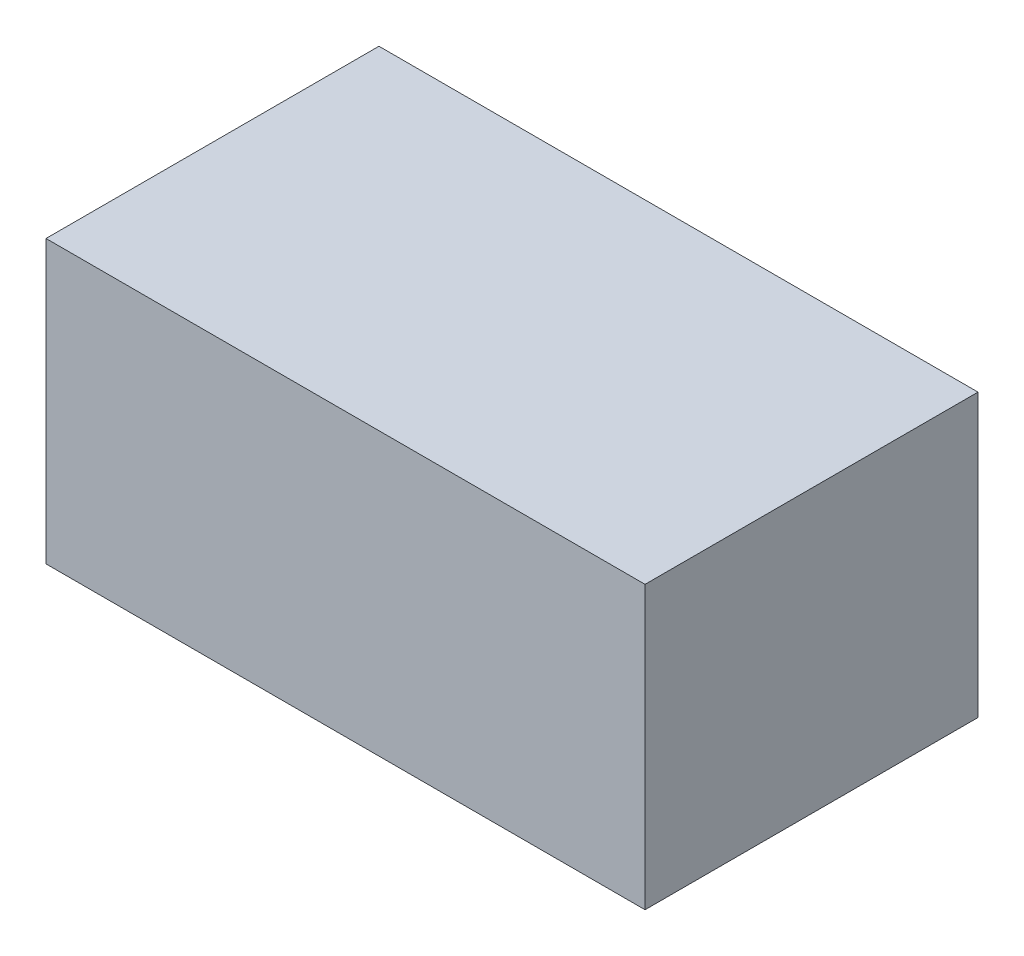
ISO-10303-21;
HEADER;
FILE_DESCRIPTION(('STEP AP214'),'2;1');
FILE_NAME('part.step','',(''),(''),'','','');
FILE_SCHEMA(('AUTOMOTIVE_DESIGN { 1 0 10303 214 1 1 1 1 }'));
ENDSEC;
DATA;
#1=APPLICATION_CONTEXT('core data for automotive mechanical design processes');
#2=APPLICATION_PROTOCOL_DEFINITION('international standard','automotive_design',2000,#1);
#3=PRODUCT_CONTEXT('',#1,'mechanical');
#4=PRODUCT('Part','Part','',(#3));
#5=PRODUCT_RELATED_PRODUCT_CATEGORY('part','',(#4));
#6=PRODUCT_DEFINITION_FORMATION('','',#4);
#7=PRODUCT_DEFINITION_CONTEXT('part definition',#1,'design');
#8=PRODUCT_DEFINITION('design','',#6,#7);
#9=PRODUCT_DEFINITION_SHAPE('','',#8);
#10=(LENGTH_UNIT() NAMED_UNIT(*) SI_UNIT(.MILLI.,.METRE.));
#11=(NAMED_UNIT(*) PLANE_ANGLE_UNIT() SI_UNIT($,.RADIAN.));
#12=(NAMED_UNIT(*) SI_UNIT($,.STERADIAN.) SOLID_ANGLE_UNIT());
#13=UNCERTAINTY_MEASURE_WITH_UNIT(LENGTH_MEASURE(1.E-05),#10,'distance_accuracy_value','');
#14=(GEOMETRIC_REPRESENTATION_CONTEXT(3) GLOBAL_UNCERTAINTY_ASSIGNED_CONTEXT((#13)) GLOBAL_UNIT_ASSIGNED_CONTEXT((#10,
#11,#12)) REPRESENTATION_CONTEXT('',''));
#15=CARTESIAN_POINT('',(0.,0.,0.));
#16=DIRECTION('',(0.,0.,1.));
#17=DIRECTION('',(1.,0.,0.));
#18=AXIS2_PLACEMENT_3D('',#15,#16,#17);
#19=CARTESIAN_POINT('',(22.85,21.5,-12.7));
#20=DIRECTION('',(-1.,0.,0.));
#21=DIRECTION('',(0.,0.,1.));
#22=AXIS2_PLACEMENT_3D('',#19,#20,#21);
#23=PLANE('',#22);
#24=DIRECTION('',(0.,0.,-1.));
#25=VECTOR('',#24,1.);
#26=CARTESIAN_POINT('',(22.85,0.,-12.7));
#27=LINE('',#26,#25);
#28=CARTESIAN_POINT('',(22.85,0.,12.7));
#29=VERTEX_POINT('',#28);
#30=CARTESIAN_POINT('',(22.85,0.,-12.7));
#31=VERTEX_POINT('',#30);
#32=EDGE_CURVE('E96',#29,#31,#27,.T.);
#33=ORIENTED_EDGE('',*,*,#32,.T.);
#34=DIRECTION('',(0.,-1.,0.));
#35=VECTOR('',#34,1.);
#36=CARTESIAN_POINT('',(22.85,21.5,-12.7));
#37=LINE('',#36,#35);
#38=CARTESIAN_POINT('',(22.85,21.5,-12.7));
#39=VERTEX_POINT('',#38);
#40=EDGE_CURVE('E11',#39,#31,#37,.T.);
#41=ORIENTED_EDGE('',*,*,#40,.F.);
#42=DIRECTION('',(0.,0.,-1.));
#43=VECTOR('',#42,1.);
#44=CARTESIAN_POINT('',(22.85,21.5,-12.7));
#45=LINE('',#44,#43);
#46=CARTESIAN_POINT('',(22.85,21.5,12.7));
#47=VERTEX_POINT('',#46);
#48=EDGE_CURVE('E84',#47,#39,#45,.T.);
#49=ORIENTED_EDGE('',*,*,#48,.F.);
#50=DIRECTION('',(0.,-1.,0.));
#51=VECTOR('',#50,1.);
#52=CARTESIAN_POINT('',(22.85,21.5,12.7));
#53=LINE('',#52,#51);
#54=EDGE_CURVE('E92',#47,#29,#53,.T.);
#55=ORIENTED_EDGE('',*,*,#54,.T.);
#56=EDGE_LOOP('',(#33,#41,#49,#55));
#57=FACE_BOUND('',#56,.T.);
#58=ADVANCED_FACE('F33',(#57),#23,.F.);
#59=CARTESIAN_POINT('',(-22.85,21.5,-12.7));
#60=DIRECTION('',(0.,0.,1.));
#61=DIRECTION('',(1.,0.,0.));
#62=AXIS2_PLACEMENT_3D('',#59,#60,#61);
#63=PLANE('',#62);
#64=DIRECTION('',(-1.,0.,0.));
#65=VECTOR('',#64,1.);
#66=CARTESIAN_POINT('',(-22.85,0.,-12.7));
#67=LINE('',#66,#65);
#68=CARTESIAN_POINT('',(-22.85,0.,-12.7));
#69=VERTEX_POINT('',#68);
#70=EDGE_CURVE('E88',#31,#69,#67,.T.);
#71=ORIENTED_EDGE('',*,*,#70,.T.);
#72=DIRECTION('',(0.,-1.,0.));
#73=VECTOR('',#72,1.);
#74=CARTESIAN_POINT('',(-22.85,21.5,-12.7));
#75=LINE('',#74,#73);
#76=CARTESIAN_POINT('',(-22.85,21.5,-12.7));
#77=VERTEX_POINT('',#76);
#78=EDGE_CURVE('E41',#77,#69,#75,.T.);
#79=ORIENTED_EDGE('',*,*,#78,.F.);
#80=DIRECTION('',(-1.,0.,0.));
#81=VECTOR('',#80,1.);
#82=CARTESIAN_POINT('',(-22.85,21.5,-12.7));
#83=LINE('',#82,#81);
#84=EDGE_CURVE('E79',#39,#77,#83,.T.);
#85=ORIENTED_EDGE('',*,*,#84,.F.);
#86=ORIENTED_EDGE('',*,*,#40,.T.);
#87=EDGE_LOOP('',(#71,#79,#85,#86));
#88=FACE_BOUND('',#87,.T.);
#89=ADVANCED_FACE('F87',(#88),#63,.F.);
#90=CARTESIAN_POINT('',(-22.85,21.5,-12.7));
#91=DIRECTION('',(1.,0.,0.));
#92=DIRECTION('',(0.,0.,-1.));
#93=AXIS2_PLACEMENT_3D('',#90,#91,#92);
#94=PLANE('',#93);
#95=DIRECTION('',(0.,0.,1.));
#96=VECTOR('',#95,1.);
#97=CARTESIAN_POINT('',(-22.85,0.,-12.7));
#98=LINE('',#97,#96);
#99=CARTESIAN_POINT('',(-22.85,0.,12.7));
#100=VERTEX_POINT('',#99);
#101=EDGE_CURVE('E66',#69,#100,#98,.T.);
#102=ORIENTED_EDGE('',*,*,#101,.T.);
#103=DIRECTION('',(0.,-1.,0.));
#104=VECTOR('',#103,1.);
#105=CARTESIAN_POINT('',(-22.85,21.5,12.7));
#106=LINE('',#105,#104);
#107=CARTESIAN_POINT('',(-22.85,21.5,12.7));
#108=VERTEX_POINT('',#107);
#109=EDGE_CURVE('E89',#108,#100,#106,.T.);
#110=ORIENTED_EDGE('',*,*,#109,.F.);
#111=DIRECTION('',(0.,0.,1.));
#112=VECTOR('',#111,1.);
#113=CARTESIAN_POINT('',(-22.85,21.5,-12.7));
#114=LINE('',#113,#112);
#115=EDGE_CURVE('E82',#77,#108,#114,.T.);
#116=ORIENTED_EDGE('',*,*,#115,.F.);
#117=ORIENTED_EDGE('',*,*,#78,.T.);
#118=EDGE_LOOP('',(#102,#110,#116,#117));
#119=FACE_BOUND('',#118,.T.);
#120=ADVANCED_FACE('F90',(#119),#94,.F.);
#121=CARTESIAN_POINT('',(-22.85,21.5,12.7));
#122=DIRECTION('',(0.,0.,-1.));
#123=DIRECTION('',(-1.,0.,0.));
#124=AXIS2_PLACEMENT_3D('',#121,#122,#123);
#125=PLANE('',#124);
#126=DIRECTION('',(1.,0.,0.));
#127=VECTOR('',#126,1.);
#128=CARTESIAN_POINT('',(-22.85,0.,12.7));
#129=LINE('',#128,#127);
#130=EDGE_CURVE('E72',#100,#29,#129,.T.);
#131=ORIENTED_EDGE('',*,*,#130,.T.);
#132=ORIENTED_EDGE('',*,*,#54,.F.);
#133=DIRECTION('',(1.,0.,0.));
#134=VECTOR('',#133,1.);
#135=CARTESIAN_POINT('',(-22.85,21.5,12.7));
#136=LINE('',#135,#134);
#137=EDGE_CURVE('E49',#108,#47,#136,.T.);
#138=ORIENTED_EDGE('',*,*,#137,.F.);
#139=ORIENTED_EDGE('',*,*,#109,.T.);
#140=EDGE_LOOP('',(#131,#132,#138,#139));
#141=FACE_BOUND('',#140,.T.);
#142=ADVANCED_FACE('F103',(#141),#125,.F.);
#143=CARTESIAN_POINT('',(0.,21.5,0.));
#144=DIRECTION('',(0.,1.,0.));
#145=DIRECTION('',(0.,0.,1.));
#146=AXIS2_PLACEMENT_3D('',#143,#144,#145);
#147=PLANE('',#146);
#148=ORIENTED_EDGE('',*,*,#48,.T.);
#149=ORIENTED_EDGE('',*,*,#84,.T.);
#150=ORIENTED_EDGE('',*,*,#115,.T.);
#151=ORIENTED_EDGE('',*,*,#137,.T.);
#152=EDGE_LOOP('',(#148,#149,#150,#151));
#153=FACE_BOUND('',#152,.T.);
#154=ADVANCED_FACE('F80',(#153),#147,.T.);
#155=CARTESIAN_POINT('',(0.,0.,0.));
#156=DIRECTION('',(0.,1.,0.));
#157=DIRECTION('',(0.,0.,1.));
#158=AXIS2_PLACEMENT_3D('',#155,#156,#157);
#159=PLANE('',#158);
#160=ORIENTED_EDGE('',*,*,#32,.F.);
#161=ORIENTED_EDGE('',*,*,#130,.F.);
#162=ORIENTED_EDGE('',*,*,#101,.F.);
#163=ORIENTED_EDGE('',*,*,#70,.F.);
#164=EDGE_LOOP('',(#160,#161,#162,#163));
#165=FACE_BOUND('',#164,.T.);
#166=ADVANCED_FACE('F106',(#165),#159,.F.);
#167=CLOSED_SHELL('',(#58,#89,#120,#142,#154,#166));
#168=MANIFOLD_SOLID_BREP('B2',#167);
#169=ADVANCED_BREP_SHAPE_REPRESENTATION('',(#18,#168),#14);
#170=SHAPE_DEFINITION_REPRESENTATION(#9,#169);
ENDSEC;
END-ISO-10303-21;
